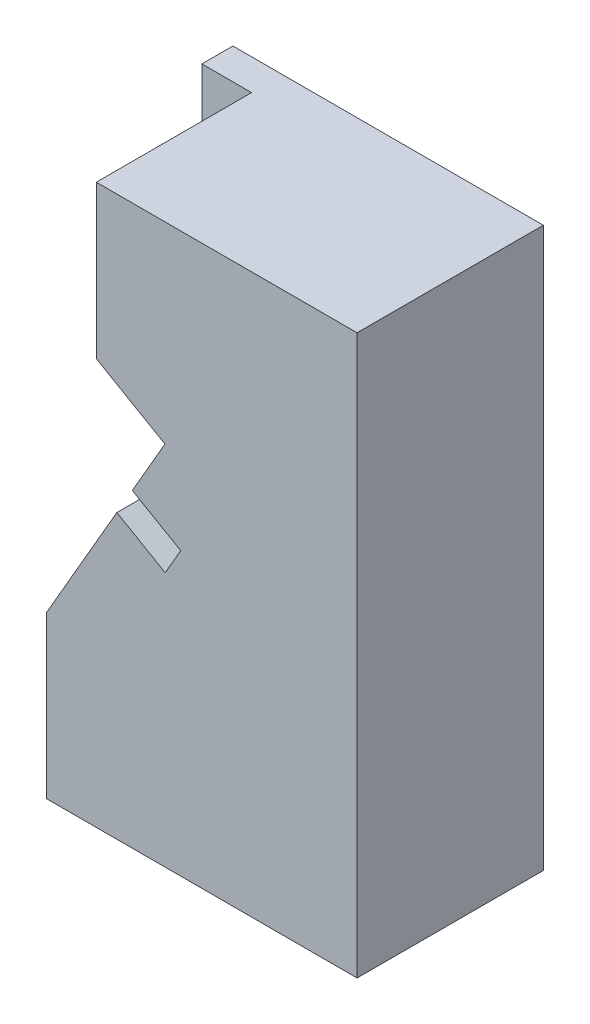
ISO-10303-21;
HEADER;
FILE_DESCRIPTION(('STEP AP214'),'2;1');
FILE_NAME('part.step','',(''),(''),'','','');
FILE_SCHEMA(('AUTOMOTIVE_DESIGN { 1 0 10303 214 1 1 1 1 }'));
ENDSEC;
DATA;
#1=APPLICATION_CONTEXT('core data for automotive mechanical design processes');
#2=APPLICATION_PROTOCOL_DEFINITION('international standard','automotive_design',2000,#1);
#3=PRODUCT_CONTEXT('',#1,'mechanical');
#4=PRODUCT('Part','Part','',(#3));
#5=PRODUCT_RELATED_PRODUCT_CATEGORY('part','',(#4));
#6=PRODUCT_DEFINITION_FORMATION('','',#4);
#7=PRODUCT_DEFINITION_CONTEXT('part definition',#1,'design');
#8=PRODUCT_DEFINITION('design','',#6,#7);
#9=PRODUCT_DEFINITION_SHAPE('','',#8);
#10=(LENGTH_UNIT() NAMED_UNIT(*) SI_UNIT(.MILLI.,.METRE.));
#11=(NAMED_UNIT(*) PLANE_ANGLE_UNIT() SI_UNIT($,.RADIAN.));
#12=(NAMED_UNIT(*) SI_UNIT($,.STERADIAN.) SOLID_ANGLE_UNIT());
#13=UNCERTAINTY_MEASURE_WITH_UNIT(LENGTH_MEASURE(1.E-05),#10,'distance_accuracy_value','');
#14=(GEOMETRIC_REPRESENTATION_CONTEXT(3) GLOBAL_UNCERTAINTY_ASSIGNED_CONTEXT((#13)) GLOBAL_UNIT_ASSIGNED_CONTEXT((#10,
#11,#12)) REPRESENTATION_CONTEXT('',''));
#15=CARTESIAN_POINT('',(0.,0.,0.));
#16=DIRECTION('',(0.,0.,1.));
#17=DIRECTION('',(1.,0.,0.));
#18=AXIS2_PLACEMENT_3D('',#15,#16,#17);
#19=CARTESIAN_POINT('',(-12.5,22.5,-7.5));
#20=DIRECTION('',(1.,0.,0.));
#21=DIRECTION('',(0.,0.,-1.));
#22=AXIS2_PLACEMENT_3D('',#19,#20,#21);
#23=PLANE('',#22);
#24=DIRECTION('',(0.,-1.,0.));
#25=VECTOR('',#24,1.);
#26=CARTESIAN_POINT('',(-12.5,22.5,7.5));
#27=LINE('',#26,#25);
#28=CARTESIAN_POINT('',(-12.5,-9.5,7.5));
#29=VERTEX_POINT('',#28);
#30=CARTESIAN_POINT('',(-12.5,-22.5,7.5));
#31=VERTEX_POINT('',#30);
#32=EDGE_CURVE('E218',#29,#31,#27,.T.);
#33=ORIENTED_EDGE('',*,*,#32,.F.);
#34=DIRECTION('',(0.,0.,1.));
#35=VECTOR('',#34,1.);
#36=CARTESIAN_POINT('',(-12.5,-9.5,-5.));
#37=LINE('',#36,#35);
#38=CARTESIAN_POINT('',(-12.5,-9.5,-5.));
#39=VERTEX_POINT('',#38);
#40=EDGE_CURVE('E191',#39,#29,#37,.T.);
#41=ORIENTED_EDGE('',*,*,#40,.F.);
#42=DIRECTION('',(0.,-1.,0.));
#43=VECTOR('',#42,1.);
#44=CARTESIAN_POINT('',(-12.5,24.7905989232415,-5.));
#45=LINE('',#44,#43);
#46=CARTESIAN_POINT('',(-12.5,22.5,-5.));
#47=VERTEX_POINT('',#46);
#48=EDGE_CURVE('E158',#47,#39,#45,.T.);
#49=ORIENTED_EDGE('',*,*,#48,.F.);
#50=DIRECTION('',(0.,0.,1.));
#51=VECTOR('',#50,1.);
#52=CARTESIAN_POINT('',(-12.5,22.5,-7.5));
#53=LINE('',#52,#51);
#54=CARTESIAN_POINT('',(-12.5,22.5,-7.5));
#55=VERTEX_POINT('',#54);
#56=EDGE_CURVE('E194',#55,#47,#53,.T.);
#57=ORIENTED_EDGE('',*,*,#56,.F.);
#58=DIRECTION('',(0.,-1.,0.));
#59=VECTOR('',#58,1.);
#60=CARTESIAN_POINT('',(-12.5,22.5,-7.5));
#61=LINE('',#60,#59);
#62=CARTESIAN_POINT('',(-12.5,-22.5,-7.5));
#63=VERTEX_POINT('',#62);
#64=EDGE_CURVE('E55',#55,#63,#61,.T.);
#65=ORIENTED_EDGE('',*,*,#64,.T.);
#66=DIRECTION('',(0.,0.,1.));
#67=VECTOR('',#66,1.);
#68=CARTESIAN_POINT('',(-12.5,-22.5,-7.5));
#69=LINE('',#68,#67);
#70=EDGE_CURVE('E184',#63,#31,#69,.T.);
#71=ORIENTED_EDGE('',*,*,#70,.T.);
#72=EDGE_LOOP('',(#33,#41,#49,#57,#65,#71));
#73=FACE_BOUND('',#72,.T.);
#74=ADVANCED_FACE('F33',(#73),#23,.F.);
#75=CARTESIAN_POINT('',(-12.5,22.5,7.5));
#76=DIRECTION('',(0.,0.,-1.));
#77=DIRECTION('',(-1.,0.,0.));
#78=AXIS2_PLACEMENT_3D('',#75,#76,#77);
#79=PLANE('',#78);
#80=DIRECTION('',(0.866025403784437,-0.500000000000003,0.));
#81=VECTOR('',#80,1.);
#82=CARTESIAN_POINT('',(-2.95160624134119,-1.96169687932941,7.5));
#83=LINE('',#82,#81);
#84=CARTESIAN_POINT('',(-6.84872055837116,0.288303120670604,7.5));
#85=VERTEX_POINT('',#84);
#86=CARTESIAN_POINT('',(-2.95160624134119,-1.96169687932941,7.5));
#87=VERTEX_POINT('',#86);
#88=EDGE_CURVE('E177',#85,#87,#83,.T.);
#89=ORIENTED_EDGE('',*,*,#88,.F.);
#90=DIRECTION('',(0.500000000000001,0.866025403784438,0.));
#91=VECTOR('',#90,1.);
#92=CARTESIAN_POINT('',(-6.84872055837116,0.288303120670604,7.5));
#93=LINE('',#92,#91);
#94=EDGE_CURVE('E174',#29,#85,#93,.T.);
#95=ORIENTED_EDGE('',*,*,#94,.F.);
#96=ORIENTED_EDGE('',*,*,#32,.T.);
#97=DIRECTION('',(1.,0.,0.));
#98=VECTOR('',#97,1.);
#99=CARTESIAN_POINT('',(-12.5,-22.5,7.5));
#100=LINE('',#99,#98);
#101=CARTESIAN_POINT('',(12.5,-22.5,7.5));
#102=VERTEX_POINT('',#101);
#103=EDGE_CURVE('E205',#31,#102,#100,.T.);
#104=ORIENTED_EDGE('',*,*,#103,.T.);
#105=DIRECTION('',(0.,-1.,0.));
#106=VECTOR('',#105,1.);
#107=CARTESIAN_POINT('',(12.5,22.5,7.5));
#108=LINE('',#107,#106);
#109=CARTESIAN_POINT('',(12.5,22.5,7.5));
#110=VERTEX_POINT('',#109);
#111=EDGE_CURVE('E216',#110,#102,#108,.T.);
#112=ORIENTED_EDGE('',*,*,#111,.F.);
#113=DIRECTION('',(1.,0.,0.));
#114=VECTOR('',#113,1.);
#115=CARTESIAN_POINT('',(-12.5,22.5,7.5));
#116=LINE('',#115,#114);
#117=CARTESIAN_POINT('',(-8.5,22.5,7.5));
#118=VERTEX_POINT('',#117);
#119=EDGE_CURVE('E80',#118,#110,#116,.T.);
#120=ORIENTED_EDGE('',*,*,#119,.F.);
#121=DIRECTION('',(0.,1.,0.));
#122=VECTOR('',#121,1.);
#123=CARTESIAN_POINT('',(-8.5,24.7905989232415,7.5));
#124=LINE('',#123,#122);
#125=CARTESIAN_POINT('',(-8.5,10.1905989232415,7.5));
#126=VERTEX_POINT('',#125);
#127=EDGE_CURVE('E172',#126,#118,#124,.T.);
#128=ORIENTED_EDGE('',*,*,#127,.F.);
#129=DIRECTION('',(-0.866025403784437,0.500000000000004,0.));
#130=VECTOR('',#129,1.);
#131=CARTESIAN_POINT('',(-8.5,10.1905989232415,7.5));
#132=LINE('',#131,#130);
#133=CARTESIAN_POINT('',(-2.97372055837115,6.99999999999999,7.5));
#134=VERTEX_POINT('',#133);
#135=EDGE_CURVE('E170',#134,#126,#132,.T.);
#136=ORIENTED_EDGE('',*,*,#135,.F.);
#137=DIRECTION('',(0.500000000000001,0.866025403784438,0.));
#138=VECTOR('',#137,1.);
#139=CARTESIAN_POINT('',(-2.97372055837115,6.99999999999999,7.5));
#140=LINE('',#139,#138);
#141=CARTESIAN_POINT('',(-5.59872055837116,2.45336663013169,7.5));
#142=VERTEX_POINT('',#141);
#143=EDGE_CURVE('E138',#142,#134,#140,.T.);
#144=ORIENTED_EDGE('',*,*,#143,.F.);
#145=DIRECTION('',(-0.866025403784438,0.500000000000002,0.));
#146=VECTOR('',#145,1.);
#147=CARTESIAN_POINT('',(-5.59872055837116,2.45336663013169,7.5));
#148=LINE('',#147,#146);
#149=CARTESIAN_POINT('',(-1.70160624134117,0.203366630131674,7.5));
#150=VERTEX_POINT('',#149);
#151=EDGE_CURVE('E151',#150,#142,#148,.T.);
#152=ORIENTED_EDGE('',*,*,#151,.F.);
#153=DIRECTION('',(0.500000000000008,0.866025403784434,0.));
#154=VECTOR('',#153,1.);
#155=CARTESIAN_POINT('',(-1.70160624134117,0.203366630131674,7.5));
#156=LINE('',#155,#154);
#157=EDGE_CURVE('E154',#87,#150,#156,.T.);
#158=ORIENTED_EDGE('',*,*,#157,.F.);
#159=EDGE_LOOP('',(#89,#95,#96,#104,#112,#120,#128,#136,#144,#152,#158));
#160=FACE_BOUND('',#159,.T.);
#161=ADVANCED_FACE('F231',(#160),#79,.F.);
#162=CARTESIAN_POINT('',(12.5,22.5,-7.5));
#163=DIRECTION('',(1.,0.,0.));
#164=DIRECTION('',(0.,0.,-1.));
#165=AXIS2_PLACEMENT_3D('',#162,#163,#164);
#166=PLANE('',#165);
#167=DIRECTION('',(0.,0.,1.));
#168=VECTOR('',#167,1.);
#169=CARTESIAN_POINT('',(12.5,-22.5,-7.5));
#170=LINE('',#169,#168);
#171=CARTESIAN_POINT('',(12.5,-22.5,-7.5));
#172=VERTEX_POINT('',#171);
#173=EDGE_CURVE('E208',#172,#102,#170,.T.);
#174=ORIENTED_EDGE('',*,*,#173,.F.);
#175=DIRECTION('',(0.,-1.,0.));
#176=VECTOR('',#175,1.);
#177=CARTESIAN_POINT('',(12.5,22.5,-7.5));
#178=LINE('',#177,#176);
#179=CARTESIAN_POINT('',(12.5,22.5,-7.5));
#180=VERTEX_POINT('',#179);
#181=EDGE_CURVE('E214',#180,#172,#178,.T.);
#182=ORIENTED_EDGE('',*,*,#181,.F.);
#183=DIRECTION('',(0.,0.,1.));
#184=VECTOR('',#183,1.);
#185=CARTESIAN_POINT('',(12.5,22.5,-7.5));
#186=LINE('',#185,#184);
#187=EDGE_CURVE('E199',#180,#110,#186,.T.);
#188=ORIENTED_EDGE('',*,*,#187,.T.);
#189=ORIENTED_EDGE('',*,*,#111,.T.);
#190=EDGE_LOOP('',(#174,#182,#188,#189));
#191=FACE_BOUND('',#190,.T.);
#192=ADVANCED_FACE('F257',(#191),#166,.T.);
#193=CARTESIAN_POINT('',(-12.5,22.5,-7.5));
#194=DIRECTION('',(0.,0.,-1.));
#195=DIRECTION('',(-1.,0.,0.));
#196=AXIS2_PLACEMENT_3D('',#193,#194,#195);
#197=PLANE('',#196);
#198=DIRECTION('',(1.,0.,0.));
#199=VECTOR('',#198,1.);
#200=CARTESIAN_POINT('',(-12.5,-22.5,-7.5));
#201=LINE('',#200,#199);
#202=EDGE_CURVE('E197',#63,#172,#201,.T.);
#203=ORIENTED_EDGE('',*,*,#202,.F.);
#204=ORIENTED_EDGE('',*,*,#64,.F.);
#205=DIRECTION('',(1.,0.,0.));
#206=VECTOR('',#205,1.);
#207=CARTESIAN_POINT('',(-12.5,22.5,-7.5));
#208=LINE('',#207,#206);
#209=EDGE_CURVE('E202',#55,#180,#208,.T.);
#210=ORIENTED_EDGE('',*,*,#209,.T.);
#211=ORIENTED_EDGE('',*,*,#181,.T.);
#212=EDGE_LOOP('',(#203,#204,#210,#211));
#213=FACE_BOUND('',#212,.T.);
#214=ADVANCED_FACE('F261',(#213),#197,.T.);
#215=CARTESIAN_POINT('',(0.,22.5,0.));
#216=DIRECTION('',(0.,1.,0.));
#217=DIRECTION('',(0.,0.,1.));
#218=AXIS2_PLACEMENT_3D('',#215,#216,#217);
#219=PLANE('',#218);
#220=DIRECTION('',(0.,0.,-1.));
#221=VECTOR('',#220,1.);
#222=CARTESIAN_POINT('',(-8.5,22.5,0.));
#223=LINE('',#222,#221);
#224=CARTESIAN_POINT('',(-8.5,22.5,-5.));
#225=VERTEX_POINT('',#224);
#226=EDGE_CURVE('E11',#118,#225,#223,.T.);
#227=ORIENTED_EDGE('',*,*,#226,.F.);
#228=ORIENTED_EDGE('',*,*,#119,.T.);
#229=ORIENTED_EDGE('',*,*,#187,.F.);
#230=ORIENTED_EDGE('',*,*,#209,.F.);
#231=ORIENTED_EDGE('',*,*,#56,.T.);
#232=DIRECTION('',(1.,0.,0.));
#233=VECTOR('',#232,1.);
#234=CARTESIAN_POINT('',(0.,22.5,-5.));
#235=LINE('',#234,#233);
#236=EDGE_CURVE('E40',#47,#225,#235,.T.);
#237=ORIENTED_EDGE('',*,*,#236,.T.);
#238=EDGE_LOOP('',(#227,#228,#229,#230,#231,#237));
#239=FACE_BOUND('',#238,.T.);
#240=ADVANCED_FACE('F220',(#239),#219,.T.);
#241=CARTESIAN_POINT('',(0.,-22.5,0.));
#242=DIRECTION('',(0.,1.,0.));
#243=DIRECTION('',(0.,0.,1.));
#244=AXIS2_PLACEMENT_3D('',#241,#242,#243);
#245=PLANE('',#244);
#246=ORIENTED_EDGE('',*,*,#70,.F.);
#247=ORIENTED_EDGE('',*,*,#202,.T.);
#248=ORIENTED_EDGE('',*,*,#173,.T.);
#249=ORIENTED_EDGE('',*,*,#103,.F.);
#250=EDGE_LOOP('',(#246,#247,#248,#249));
#251=FACE_BOUND('',#250,.T.);
#252=ADVANCED_FACE('F267',(#251),#245,.F.);
#253=CARTESIAN_POINT('',(-2.97372055837115,6.99999999999999,-5.));
#254=DIRECTION('',(0.866025403784438,-0.500000000000001,0.));
#255=DIRECTION('',(0.500000000000001,0.866025403784438,0.));
#256=AXIS2_PLACEMENT_3D('',#253,#254,#255);
#257=PLANE('',#256);
#258=ORIENTED_EDGE('',*,*,#143,.T.);
#259=DIRECTION('',(0.,0.,1.));
#260=VECTOR('',#259,1.);
#261=CARTESIAN_POINT('',(-2.97372055837115,6.99999999999999,-5.));
#262=LINE('',#261,#260);
#263=CARTESIAN_POINT('',(-2.97372055837115,6.99999999999999,-5.));
#264=VERTEX_POINT('',#263);
#265=EDGE_CURVE('E131',#264,#134,#262,.T.);
#266=ORIENTED_EDGE('',*,*,#265,.F.);
#267=DIRECTION('',(0.500000000000001,0.866025403784438,0.));
#268=VECTOR('',#267,1.);
#269=CARTESIAN_POINT('',(-2.97372055837115,6.99999999999999,-5.));
#270=LINE('',#269,#268);
#271=CARTESIAN_POINT('',(-5.59872055837116,2.45336663013169,-5.));
#272=VERTEX_POINT('',#271);
#273=EDGE_CURVE('E135',#272,#264,#270,.T.);
#274=ORIENTED_EDGE('',*,*,#273,.F.);
#275=DIRECTION('',(0.,0.,1.));
#276=VECTOR('',#275,1.);
#277=CARTESIAN_POINT('',(-5.59872055837116,2.45336663013169,-5.));
#278=LINE('',#277,#276);
#279=EDGE_CURVE('E182',#272,#142,#278,.T.);
#280=ORIENTED_EDGE('',*,*,#279,.T.);
#281=EDGE_LOOP('',(#258,#266,#274,#280));
#282=FACE_BOUND('',#281,.T.);
#283=ADVANCED_FACE('F133',(#282),#257,.F.);
#284=CARTESIAN_POINT('',(-5.59872055837116,2.45336663013169,-5.));
#285=DIRECTION('',(0.500000000000002,0.866025403784438,0.));
#286=DIRECTION('',(-0.866025403784438,0.500000000000002,0.));
#287=AXIS2_PLACEMENT_3D('',#284,#285,#286);
#288=PLANE('',#287);
#289=ORIENTED_EDGE('',*,*,#151,.T.);
#290=ORIENTED_EDGE('',*,*,#279,.F.);
#291=DIRECTION('',(-0.866025403784438,0.500000000000002,0.));
#292=VECTOR('',#291,1.);
#293=CARTESIAN_POINT('',(-5.59872055837116,2.45336663013169,-5.));
#294=LINE('',#293,#292);
#295=CARTESIAN_POINT('',(-1.70160624134117,0.203366630131674,-5.));
#296=VERTEX_POINT('',#295);
#297=EDGE_CURVE('E143',#296,#272,#294,.T.);
#298=ORIENTED_EDGE('',*,*,#297,.F.);
#299=DIRECTION('',(0.,0.,1.));
#300=VECTOR('',#299,1.);
#301=CARTESIAN_POINT('',(-1.70160624134117,0.203366630131674,-5.));
#302=LINE('',#301,#300);
#303=EDGE_CURVE('E185',#296,#150,#302,.T.);
#304=ORIENTED_EDGE('',*,*,#303,.T.);
#305=EDGE_LOOP('',(#289,#290,#298,#304));
#306=FACE_BOUND('',#305,.T.);
#307=ADVANCED_FACE('F241',(#306),#288,.F.);
#308=CARTESIAN_POINT('',(-1.70160624134117,0.203366630131674,-5.));
#309=DIRECTION('',(0.866025403784434,-0.500000000000007,0.));
#310=DIRECTION('',(0.500000000000008,0.866025403784434,0.));
#311=AXIS2_PLACEMENT_3D('',#308,#309,#310);
#312=PLANE('',#311);
#313=ORIENTED_EDGE('',*,*,#157,.T.);
#314=ORIENTED_EDGE('',*,*,#303,.F.);
#315=DIRECTION('',(0.500000000000008,0.866025403784434,0.));
#316=VECTOR('',#315,1.);
#317=CARTESIAN_POINT('',(-1.70160624134117,0.203366630131674,-5.));
#318=LINE('',#317,#316);
#319=CARTESIAN_POINT('',(-2.95160624134119,-1.96169687932941,-5.));
#320=VERTEX_POINT('',#319);
#321=EDGE_CURVE('E166',#320,#296,#318,.T.);
#322=ORIENTED_EDGE('',*,*,#321,.F.);
#323=DIRECTION('',(0.,0.,1.));
#324=VECTOR('',#323,1.);
#325=CARTESIAN_POINT('',(-2.95160624134119,-1.96169687932941,-5.));
#326=LINE('',#325,#324);
#327=EDGE_CURVE('E187',#320,#87,#326,.T.);
#328=ORIENTED_EDGE('',*,*,#327,.T.);
#329=EDGE_LOOP('',(#313,#314,#322,#328));
#330=FACE_BOUND('',#329,.T.);
#331=ADVANCED_FACE('F277',(#330),#312,.F.);
#332=CARTESIAN_POINT('',(-2.95160624134119,-1.96169687932941,-5.));
#333=DIRECTION('',(-0.500000000000003,-0.866025403784437,0.));
#334=DIRECTION('',(0.866025403784437,-0.500000000000003,0.));
#335=AXIS2_PLACEMENT_3D('',#332,#333,#334);
#336=PLANE('',#335);
#337=ORIENTED_EDGE('',*,*,#88,.T.);
#338=ORIENTED_EDGE('',*,*,#327,.F.);
#339=DIRECTION('',(0.866025403784437,-0.500000000000003,0.));
#340=VECTOR('',#339,1.);
#341=CARTESIAN_POINT('',(-2.95160624134119,-1.96169687932941,-5.));
#342=LINE('',#341,#340);
#343=CARTESIAN_POINT('',(-6.84872055837116,0.288303120670604,-5.));
#344=VERTEX_POINT('',#343);
#345=EDGE_CURVE('E163',#344,#320,#342,.T.);
#346=ORIENTED_EDGE('',*,*,#345,.F.);
#347=DIRECTION('',(0.,0.,1.));
#348=VECTOR('',#347,1.);
#349=CARTESIAN_POINT('',(-6.84872055837116,0.288303120670604,-5.));
#350=LINE('',#349,#348);
#351=EDGE_CURVE('E189',#344,#85,#350,.T.);
#352=ORIENTED_EDGE('',*,*,#351,.T.);
#353=EDGE_LOOP('',(#337,#338,#346,#352));
#354=FACE_BOUND('',#353,.T.);
#355=ADVANCED_FACE('F236',(#354),#336,.F.);
#356=CARTESIAN_POINT('',(-6.84872055837116,0.288303120670604,-5.));
#357=DIRECTION('',(0.866025403784438,-0.500000000000001,0.));
#358=DIRECTION('',(0.500000000000001,0.866025403784438,0.));
#359=AXIS2_PLACEMENT_3D('',#356,#357,#358);
#360=PLANE('',#359);
#361=ORIENTED_EDGE('',*,*,#94,.T.);
#362=ORIENTED_EDGE('',*,*,#351,.F.);
#363=DIRECTION('',(0.500000000000001,0.866025403784438,0.));
#364=VECTOR('',#363,1.);
#365=CARTESIAN_POINT('',(-6.84872055837116,0.288303120670604,-5.));
#366=LINE('',#365,#364);
#367=EDGE_CURVE('E160',#39,#344,#366,.T.);
#368=ORIENTED_EDGE('',*,*,#367,.F.);
#369=ORIENTED_EDGE('',*,*,#40,.T.);
#370=EDGE_LOOP('',(#361,#362,#368,#369));
#371=FACE_BOUND('',#370,.T.);
#372=ADVANCED_FACE('F228',(#371),#360,.F.);
#373=CARTESIAN_POINT('',(-8.5,24.7905989232415,-5.));
#374=DIRECTION('',(1.,0.,0.));
#375=DIRECTION('',(0.,0.,-1.));
#376=AXIS2_PLACEMENT_3D('',#373,#374,#375);
#377=PLANE('',#376);
#378=ORIENTED_EDGE('',*,*,#226,.T.);
#379=DIRECTION('',(0.,1.,0.));
#380=VECTOR('',#379,1.);
#381=CARTESIAN_POINT('',(-8.5,24.7905989232415,-5.));
#382=LINE('',#381,#380);
#383=CARTESIAN_POINT('',(-8.5,10.1905989232415,-5.));
#384=VERTEX_POINT('',#383);
#385=EDGE_CURVE('E47',#384,#225,#382,.T.);
#386=ORIENTED_EDGE('',*,*,#385,.F.);
#387=DIRECTION('',(0.,0.,1.));
#388=VECTOR('',#387,1.);
#389=CARTESIAN_POINT('',(-8.5,10.1905989232415,-5.));
#390=LINE('',#389,#388);
#391=EDGE_CURVE('E142',#384,#126,#390,.T.);
#392=ORIENTED_EDGE('',*,*,#391,.T.);
#393=ORIENTED_EDGE('',*,*,#127,.T.);
#394=EDGE_LOOP('',(#378,#386,#392,#393));
#395=FACE_BOUND('',#394,.T.);
#396=ADVANCED_FACE('F244',(#395),#377,.F.);
#397=CARTESIAN_POINT('',(-8.5,10.1905989232415,-5.));
#398=DIRECTION('',(0.500000000000004,0.866025403784437,0.));
#399=DIRECTION('',(-0.866025403784437,0.500000000000004,0.));
#400=AXIS2_PLACEMENT_3D('',#397,#398,#399);
#401=PLANE('',#400);
#402=ORIENTED_EDGE('',*,*,#135,.T.);
#403=ORIENTED_EDGE('',*,*,#391,.F.);
#404=DIRECTION('',(-0.866025403784437,0.500000000000004,0.));
#405=VECTOR('',#404,1.);
#406=CARTESIAN_POINT('',(-8.5,10.1905989232415,-5.));
#407=LINE('',#406,#405);
#408=EDGE_CURVE('E145',#264,#384,#407,.T.);
#409=ORIENTED_EDGE('',*,*,#408,.F.);
#410=ORIENTED_EDGE('',*,*,#265,.T.);
#411=EDGE_LOOP('',(#402,#403,#409,#410));
#412=FACE_BOUND('',#411,.T.);
#413=ADVANCED_FACE('F146',(#412),#401,.F.);
#414=CARTESIAN_POINT('',(0.,0.,-5.));
#415=DIRECTION('',(0.,0.,1.));
#416=DIRECTION('',(1.,0.,0.));
#417=AXIS2_PLACEMENT_3D('',#414,#415,#416);
#418=PLANE('',#417);
#419=ORIENTED_EDGE('',*,*,#48,.T.);
#420=ORIENTED_EDGE('',*,*,#367,.T.);
#421=ORIENTED_EDGE('',*,*,#345,.T.);
#422=ORIENTED_EDGE('',*,*,#321,.T.);
#423=ORIENTED_EDGE('',*,*,#297,.T.);
#424=ORIENTED_EDGE('',*,*,#273,.T.);
#425=ORIENTED_EDGE('',*,*,#408,.T.);
#426=ORIENTED_EDGE('',*,*,#385,.T.);
#427=ORIENTED_EDGE('',*,*,#236,.F.);
#428=EDGE_LOOP('',(#419,#420,#421,#422,#423,#424,#425,#426,#427));
#429=FACE_BOUND('',#428,.T.);
#430=ADVANCED_FACE('F148',(#429),#418,.T.);
#431=CLOSED_SHELL('',(#74,#161,#192,#214,#240,#252,#283,#307,#331,#355,#372,#396,#413,#430));
#432=MANIFOLD_SOLID_BREP('B2',#431);
#433=ADVANCED_BREP_SHAPE_REPRESENTATION('',(#18,#432),#14);
#434=SHAPE_DEFINITION_REPRESENTATION(#9,#433);
ENDSEC;
END-ISO-10303-21;
